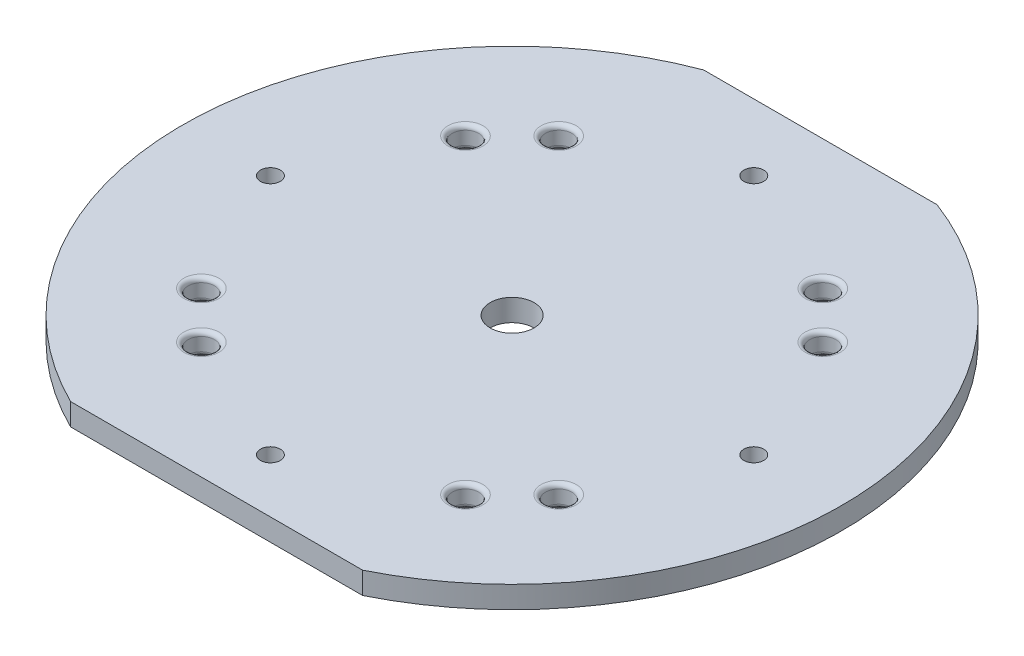
ISO-10303-21;
HEADER;
FILE_DESCRIPTION(('STEP AP214'),'2;1');
FILE_NAME('part.step','',(''),(''),'','','');
FILE_SCHEMA(('AUTOMOTIVE_DESIGN { 1 0 10303 214 1 1 1 1 }'));
ENDSEC;
DATA;
#1=APPLICATION_CONTEXT('core data for automotive mechanical design processes');
#2=APPLICATION_PROTOCOL_DEFINITION('international standard','automotive_design',2000,#1);
#3=PRODUCT_CONTEXT('',#1,'mechanical');
#4=PRODUCT('Part','Part','',(#3));
#5=PRODUCT_RELATED_PRODUCT_CATEGORY('part','',(#4));
#6=PRODUCT_DEFINITION_FORMATION('','',#4);
#7=PRODUCT_DEFINITION_CONTEXT('part definition',#1,'design');
#8=PRODUCT_DEFINITION('design','',#6,#7);
#9=PRODUCT_DEFINITION_SHAPE('','',#8);
#10=(LENGTH_UNIT() NAMED_UNIT(*) SI_UNIT(.MILLI.,.METRE.));
#11=(NAMED_UNIT(*) PLANE_ANGLE_UNIT() SI_UNIT($,.RADIAN.));
#12=(NAMED_UNIT(*) SI_UNIT($,.STERADIAN.) SOLID_ANGLE_UNIT());
#13=UNCERTAINTY_MEASURE_WITH_UNIT(LENGTH_MEASURE(1.E-05),#10,'distance_accuracy_value','');
#14=(GEOMETRIC_REPRESENTATION_CONTEXT(3) GLOBAL_UNCERTAINTY_ASSIGNED_CONTEXT((#13)) GLOBAL_UNIT_ASSIGNED_CONTEXT((#10,
#11,#12)) REPRESENTATION_CONTEXT('',''));
#15=CARTESIAN_POINT('',(0.,0.,0.));
#16=DIRECTION('',(0.,0.,1.));
#17=DIRECTION('',(1.,0.,0.));
#18=AXIS2_PLACEMENT_3D('',#15,#16,#17);
#19=CARTESIAN_POINT('',(0.,0.,0.));
#20=DIRECTION('',(0.,-1.,0.));
#21=DIRECTION('',(0.,0.,-1.));
#22=AXIS2_PLACEMENT_3D('',#19,#20,#21);
#23=CYLINDRICAL_SURFACE('',#22,75.);
#24=DIRECTION('',(0.,-1.,0.));
#25=VECTOR('',#24,1.);
#26=CARTESIAN_POINT('',(26.5518360947035,45.,-70.1427116670007));
#27=LINE('',#26,#25);
#28=CARTESIAN_POINT('',(26.5518360947035,5.,-70.1427116670007));
#29=VERTEX_POINT('',#28);
#30=CARTESIAN_POINT('',(26.5518360947035,0.,-70.1427116670007));
#31=VERTEX_POINT('',#30);
#32=EDGE_CURVE('E70',#29,#31,#27,.T.);
#33=ORIENTED_EDGE('',*,*,#32,.F.);
#34=CARTESIAN_POINT('',(0.,5.,0.));
#35=DIRECTION('',(0.,1.,0.));
#36=DIRECTION('',(0.,0.,1.));
#37=AXIS2_PLACEMENT_3D('',#34,#35,#36);
#38=CIRCLE('',#37,75.);
#39=CARTESIAN_POINT('',(33.2264954516724,5.,67.238381896057));
#40=VERTEX_POINT('',#39);
#41=EDGE_CURVE('E62',#40,#29,#38,.T.);
#42=ORIENTED_EDGE('',*,*,#41,.F.);
#43=DIRECTION('',(0.,-1.,0.));
#44=VECTOR('',#43,1.);
#45=CARTESIAN_POINT('',(33.2264954516723,45.,67.238381896057));
#46=LINE('',#45,#44);
#47=CARTESIAN_POINT('',(33.2264954516723,0.,67.238381896057));
#48=VERTEX_POINT('',#47);
#49=EDGE_CURVE('E84',#40,#48,#46,.T.);
#50=ORIENTED_EDGE('',*,*,#49,.T.);
#51=CARTESIAN_POINT('',(0.,0.,0.));
#52=DIRECTION('',(0.,-1.,0.));
#53=DIRECTION('',(0.,0.,-1.));
#54=AXIS2_PLACEMENT_3D('',#51,#52,#53);
#55=CIRCLE('',#54,75.);
#56=EDGE_CURVE('E87',#31,#48,#55,.T.);
#57=ORIENTED_EDGE('',*,*,#56,.F.);
#58=EDGE_LOOP('',(#33,#42,#50,#57));
#59=FACE_BOUND('',#58,.T.);
#60=ADVANCED_FACE('F47',(#59),#23,.T.);
#61=DIRECTION('',(0.,-1.,0.));
#62=VECTOR('',#61,1.);
#63=CARTESIAN_POINT('',(-33.2264954516723,45.,67.238381896057));
#64=LINE('',#63,#62);
#65=CARTESIAN_POINT('',(-33.2264954516724,5.,67.238381896057));
#66=VERTEX_POINT('',#65);
#67=CARTESIAN_POINT('',(-33.2264954516723,0.,67.238381896057));
#68=VERTEX_POINT('',#67);
#69=EDGE_CURVE('E91',#66,#68,#64,.T.);
#70=ORIENTED_EDGE('',*,*,#69,.F.);
#71=CARTESIAN_POINT('',(-26.5518360947036,5.,-70.1427116670007));
#72=VERTEX_POINT('',#71);
#73=EDGE_CURVE('E401',#72,#66,#38,.T.);
#74=ORIENTED_EDGE('',*,*,#73,.F.);
#75=DIRECTION('',(0.,-1.,0.));
#76=VECTOR('',#75,1.);
#77=CARTESIAN_POINT('',(-26.5518360947035,45.,-70.1427116670007));
#78=LINE('',#77,#76);
#79=CARTESIAN_POINT('',(-26.5518360947035,0.,-70.1427116670007));
#80=VERTEX_POINT('',#79);
#81=EDGE_CURVE('E110',#72,#80,#78,.T.);
#82=ORIENTED_EDGE('',*,*,#81,.T.);
#83=EDGE_CURVE('E105',#68,#80,#55,.T.);
#84=ORIENTED_EDGE('',*,*,#83,.F.);
#85=EDGE_LOOP('',(#70,#74,#82,#84));
#86=FACE_BOUND('',#85,.T.);
#87=ADVANCED_FACE('F219',(#86),#23,.T.);
#88=CARTESIAN_POINT('',(-33.2264954516723,45.,67.238381896057));
#89=DIRECTION('',(0.,0.,1.));
#90=DIRECTION('',(1.,0.,0.));
#91=AXIS2_PLACEMENT_3D('',#88,#89,#90);
#92=PLANE('',#91);
#93=ORIENTED_EDGE('',*,*,#49,.F.);
#94=DIRECTION('',(-1.,0.,0.));
#95=VECTOR('',#94,1.);
#96=CARTESIAN_POINT('',(-33.2264954516723,5.,67.238381896057));
#97=LINE('',#96,#95);
#98=EDGE_CURVE('E405',#40,#66,#97,.T.);
#99=ORIENTED_EDGE('',*,*,#98,.T.);
#100=ORIENTED_EDGE('',*,*,#69,.T.);
#101=DIRECTION('',(-1.,0.,0.));
#102=VECTOR('',#101,1.);
#103=CARTESIAN_POINT('',(-33.2264954516723,0.,67.238381896057));
#104=LINE('',#103,#102);
#105=EDGE_CURVE('E95',#48,#68,#104,.T.);
#106=ORIENTED_EDGE('',*,*,#105,.F.);
#107=EDGE_LOOP('',(#93,#99,#100,#106));
#108=FACE_BOUND('',#107,.T.);
#109=ADVANCED_FACE('F96',(#108),#92,.T.);
#110=CARTESIAN_POINT('',(-26.5518360947035,45.,-70.1427116670007));
#111=DIRECTION('',(0.,0.,-1.));
#112=DIRECTION('',(-1.,0.,0.));
#113=AXIS2_PLACEMENT_3D('',#110,#111,#112);
#114=PLANE('',#113);
#115=ORIENTED_EDGE('',*,*,#81,.F.);
#116=DIRECTION('',(1.,0.,0.));
#117=VECTOR('',#116,1.);
#118=CARTESIAN_POINT('',(-26.5518360947035,5.,-70.1427116670007));
#119=LINE('',#118,#117);
#120=EDGE_CURVE('E402',#72,#29,#119,.T.);
#121=ORIENTED_EDGE('',*,*,#120,.T.);
#122=ORIENTED_EDGE('',*,*,#32,.T.);
#123=DIRECTION('',(1.,0.,0.));
#124=VECTOR('',#123,1.);
#125=CARTESIAN_POINT('',(-26.5518360947035,0.,-70.1427116670007));
#126=LINE('',#125,#124);
#127=EDGE_CURVE('E101',#80,#31,#126,.T.);
#128=ORIENTED_EDGE('',*,*,#127,.F.);
#129=EDGE_LOOP('',(#115,#121,#122,#128));
#130=FACE_BOUND('',#129,.T.);
#131=ADVANCED_FACE('F338',(#130),#114,.T.);
#132=CARTESIAN_POINT('',(5.,0.,0.));
#133=DIRECTION('',(0.,-1.,0.));
#134=DIRECTION('',(0.,0.,-1.));
#135=AXIS2_PLACEMENT_3D('',#132,#133,#134);
#136=PLANE('',#135);
#137=CARTESIAN_POINT('',(40.6586399182265,0.,-30.0520382004282));
#138=DIRECTION('',(0.,-1.,0.));
#139=DIRECTION('',(0.,0.,-1.));
#140=AXIS2_PLACEMENT_3D('',#137,#138,#139);
#141=CIRCLE('',#140,4.);
#142=CARTESIAN_POINT('',(40.6586399182265,0.,-34.0520382004282));
#143=VERTEX_POINT('',#142);
#144=EDGE_CURVE('E142',#143,#143,#141,.F.);
#145=ORIENTED_EDGE('',*,*,#144,.T.);
#146=EDGE_LOOP('',(#145));
#147=FACE_BOUND('',#146,.T.);
#148=CARTESIAN_POINT('',(30.0520382004282,0.,-40.6586399182265));
#149=DIRECTION('',(0.,-1.,0.));
#150=DIRECTION('',(0.,0.,-1.));
#151=AXIS2_PLACEMENT_3D('',#148,#149,#150);
#152=CIRCLE('',#151,4.);
#153=CARTESIAN_POINT('',(30.0520382004282,0.,-44.6586399182265));
#154=VERTEX_POINT('',#153);
#155=EDGE_CURVE('E139',#154,#154,#152,.F.);
#156=ORIENTED_EDGE('',*,*,#155,.T.);
#157=EDGE_LOOP('',(#156));
#158=FACE_BOUND('',#157,.T.);
#159=CARTESIAN_POINT('',(-30.0520382004283,0.,-40.6586399182264));
#160=DIRECTION('',(0.,-1.,0.));
#161=DIRECTION('',(0.,0.,-1.));
#162=AXIS2_PLACEMENT_3D('',#159,#160,#161);
#163=CIRCLE('',#162,4.);
#164=CARTESIAN_POINT('',(-30.0520382004283,0.,-44.6586399182264));
#165=VERTEX_POINT('',#164);
#166=EDGE_CURVE('E136',#165,#165,#163,.F.);
#167=ORIENTED_EDGE('',*,*,#166,.T.);
#168=EDGE_LOOP('',(#167));
#169=FACE_BOUND('',#168,.T.);
#170=CARTESIAN_POINT('',(-40.6586399182265,0.,-30.0520382004282));
#171=DIRECTION('',(0.,-1.,0.));
#172=DIRECTION('',(0.,0.,-1.));
#173=AXIS2_PLACEMENT_3D('',#170,#171,#172);
#174=CIRCLE('',#173,4.);
#175=CARTESIAN_POINT('',(-40.6586399182265,0.,-34.0520382004282));
#176=VERTEX_POINT('',#175);
#177=EDGE_CURVE('E133',#176,#176,#174,.F.);
#178=ORIENTED_EDGE('',*,*,#177,.T.);
#179=EDGE_LOOP('',(#178));
#180=FACE_BOUND('',#179,.T.);
#181=CARTESIAN_POINT('',(-40.6586399182265,0.,30.0520382004283));
#182=DIRECTION('',(0.,-1.,0.));
#183=DIRECTION('',(0.,0.,-1.));
#184=AXIS2_PLACEMENT_3D('',#181,#182,#183);
#185=CIRCLE('',#184,4.);
#186=CARTESIAN_POINT('',(-40.6586399182265,0.,26.0520382004283));
#187=VERTEX_POINT('',#186);
#188=EDGE_CURVE('E130',#187,#187,#185,.F.);
#189=ORIENTED_EDGE('',*,*,#188,.T.);
#190=EDGE_LOOP('',(#189));
#191=FACE_BOUND('',#190,.T.);
#192=CARTESIAN_POINT('',(-30.0520382004283,0.,40.6586399182265));
#193=DIRECTION('',(0.,-1.,0.));
#194=DIRECTION('',(0.,0.,-1.));
#195=AXIS2_PLACEMENT_3D('',#192,#193,#194);
#196=CIRCLE('',#195,4.);
#197=CARTESIAN_POINT('',(-30.0520382004283,0.,36.6586399182265));
#198=VERTEX_POINT('',#197);
#199=EDGE_CURVE('E127',#198,#198,#196,.F.);
#200=ORIENTED_EDGE('',*,*,#199,.T.);
#201=EDGE_LOOP('',(#200));
#202=FACE_BOUND('',#201,.T.);
#203=CARTESIAN_POINT('',(40.6586399182265,0.,30.0520382004283));
#204=DIRECTION('',(0.,-1.,0.));
#205=DIRECTION('',(0.,0.,-1.));
#206=AXIS2_PLACEMENT_3D('',#203,#204,#205);
#207=CIRCLE('',#206,4.);
#208=CARTESIAN_POINT('',(40.6586399182265,0.,26.0520382004283));
#209=VERTEX_POINT('',#208);
#210=EDGE_CURVE('E124',#209,#209,#207,.F.);
#211=ORIENTED_EDGE('',*,*,#210,.T.);
#212=EDGE_LOOP('',(#211));
#213=FACE_BOUND('',#212,.T.);
#214=CARTESIAN_POINT('',(30.0520382004283,0.,40.6586399182265));
#215=DIRECTION('',(0.,-1.,0.));
#216=DIRECTION('',(0.,0.,-1.));
#217=AXIS2_PLACEMENT_3D('',#214,#215,#216);
#218=CIRCLE('',#217,4.);
#219=CARTESIAN_POINT('',(30.0520382004283,0.,36.6586399182265));
#220=VERTEX_POINT('',#219);
#221=EDGE_CURVE('E121',#220,#220,#218,.F.);
#222=ORIENTED_EDGE('',*,*,#221,.T.);
#223=EDGE_LOOP('',(#222));
#224=FACE_BOUND('',#223,.T.);
#225=CARTESIAN_POINT('',(-55.,0.,0.));
#226=DIRECTION('',(0.,-1.,0.));
#227=DIRECTION('',(0.,0.,-1.));
#228=AXIS2_PLACEMENT_3D('',#225,#226,#227);
#229=CIRCLE('',#228,2.25);
#230=CARTESIAN_POINT('',(-55.,0.,-2.25));
#231=VERTEX_POINT('',#230);
#232=EDGE_CURVE('E407',#231,#231,#229,.T.);
#233=ORIENTED_EDGE('',*,*,#232,.F.);
#234=EDGE_LOOP('',(#233));
#235=FACE_BOUND('',#234,.T.);
#236=CARTESIAN_POINT('',(55.,0.,0.));
#237=DIRECTION('',(0.,-1.,0.));
#238=DIRECTION('',(0.,0.,-1.));
#239=AXIS2_PLACEMENT_3D('',#236,#237,#238);
#240=CIRCLE('',#239,2.25);
#241=CARTESIAN_POINT('',(55.,0.,-2.25));
#242=VERTEX_POINT('',#241);
#243=EDGE_CURVE('E415',#242,#242,#240,.T.);
#244=ORIENTED_EDGE('',*,*,#243,.F.);
#245=EDGE_LOOP('',(#244));
#246=FACE_BOUND('',#245,.T.);
#247=CARTESIAN_POINT('',(0.,0.,-55.));
#248=DIRECTION('',(0.,-1.,0.));
#249=DIRECTION('',(0.,0.,-1.));
#250=AXIS2_PLACEMENT_3D('',#247,#248,#249);
#251=CIRCLE('',#250,2.25);
#252=CARTESIAN_POINT('',(0.,0.,-57.25));
#253=VERTEX_POINT('',#252);
#254=EDGE_CURVE('E387',#253,#253,#251,.T.);
#255=ORIENTED_EDGE('',*,*,#254,.F.);
#256=EDGE_LOOP('',(#255));
#257=FACE_BOUND('',#256,.T.);
#258=CARTESIAN_POINT('',(0.,0.,55.));
#259=DIRECTION('',(0.,-1.,0.));
#260=DIRECTION('',(0.,0.,-1.));
#261=AXIS2_PLACEMENT_3D('',#258,#259,#260);
#262=CIRCLE('',#261,2.25);
#263=CARTESIAN_POINT('',(0.,0.,52.75));
#264=VERTEX_POINT('',#263);
#265=EDGE_CURVE('E92',#264,#264,#262,.T.);
#266=ORIENTED_EDGE('',*,*,#265,.F.);
#267=EDGE_LOOP('',(#266));
#268=FACE_BOUND('',#267,.T.);
#269=CARTESIAN_POINT('',(0.,0.,0.));
#270=DIRECTION('',(0.,-1.,0.));
#271=DIRECTION('',(0.,0.,-1.));
#272=AXIS2_PLACEMENT_3D('',#269,#270,#271);
#273=CIRCLE('',#272,5.);
#274=CARTESIAN_POINT('',(0.,0.,-5.));
#275=VERTEX_POINT('',#274);
#276=EDGE_CURVE('E104',#275,#275,#273,.T.);
#277=ORIENTED_EDGE('',*,*,#276,.F.);
#278=EDGE_LOOP('',(#277));
#279=FACE_BOUND('',#278,.T.);
#280=ORIENTED_EDGE('',*,*,#83,.T.);
#281=ORIENTED_EDGE('',*,*,#127,.T.);
#282=ORIENTED_EDGE('',*,*,#56,.T.);
#283=ORIENTED_EDGE('',*,*,#105,.T.);
#284=EDGE_LOOP('',(#280,#281,#282,#283));
#285=FACE_BOUND('',#284,.T.);
#286=ADVANCED_FACE('F103',(#147,#158,#169,#180,#191,#202,#213,#224,#235,#246,#257,#268,#279,
#285),#136,.T.);
#287=CARTESIAN_POINT('',(73.,5.,0.));
#288=DIRECTION('',(0.,1.,0.));
#289=DIRECTION('',(0.,0.,1.));
#290=AXIS2_PLACEMENT_3D('',#287,#288,#289);
#291=PLANE('',#290);
#292=CARTESIAN_POINT('',(40.6586399182265,5.,-30.0520382004282));
#293=DIRECTION('',(0.,1.,0.));
#294=DIRECTION('',(0.,0.,1.));
#295=AXIS2_PLACEMENT_3D('',#292,#293,#294);
#296=CIRCLE('',#295,4.);
#297=CARTESIAN_POINT('',(40.6586399182265,5.,-26.0520382004282));
#298=VERTEX_POINT('',#297);
#299=EDGE_CURVE('E166',#298,#298,#296,.F.);
#300=ORIENTED_EDGE('',*,*,#299,.T.);
#301=EDGE_LOOP('',(#300));
#302=FACE_BOUND('',#301,.T.);
#303=CARTESIAN_POINT('',(30.0520382004282,5.,-40.6586399182265));
#304=DIRECTION('',(0.,1.,0.));
#305=DIRECTION('',(0.,0.,1.));
#306=AXIS2_PLACEMENT_3D('',#303,#304,#305);
#307=CIRCLE('',#306,4.);
#308=CARTESIAN_POINT('',(30.0520382004282,5.,-36.6586399182265));
#309=VERTEX_POINT('',#308);
#310=EDGE_CURVE('E163',#309,#309,#307,.F.);
#311=ORIENTED_EDGE('',*,*,#310,.T.);
#312=EDGE_LOOP('',(#311));
#313=FACE_BOUND('',#312,.T.);
#314=CARTESIAN_POINT('',(-30.0520382004283,5.,-40.6586399182264));
#315=DIRECTION('',(0.,1.,0.));
#316=DIRECTION('',(0.,0.,1.));
#317=AXIS2_PLACEMENT_3D('',#314,#315,#316);
#318=CIRCLE('',#317,4.);
#319=CARTESIAN_POINT('',(-30.0520382004283,5.,-36.6586399182265));
#320=VERTEX_POINT('',#319);
#321=EDGE_CURVE('E160',#320,#320,#318,.F.);
#322=ORIENTED_EDGE('',*,*,#321,.T.);
#323=EDGE_LOOP('',(#322));
#324=FACE_BOUND('',#323,.T.);
#325=CARTESIAN_POINT('',(-40.6586399182265,5.,-30.0520382004282));
#326=DIRECTION('',(0.,1.,0.));
#327=DIRECTION('',(0.,0.,1.));
#328=AXIS2_PLACEMENT_3D('',#325,#326,#327);
#329=CIRCLE('',#328,4.);
#330=CARTESIAN_POINT('',(-40.6586399182265,5.,-26.0520382004282));
#331=VERTEX_POINT('',#330);
#332=EDGE_CURVE('E157',#331,#331,#329,.F.);
#333=ORIENTED_EDGE('',*,*,#332,.T.);
#334=EDGE_LOOP('',(#333));
#335=FACE_BOUND('',#334,.T.);
#336=CARTESIAN_POINT('',(-40.6586399182265,5.,30.0520382004283));
#337=DIRECTION('',(0.,1.,0.));
#338=DIRECTION('',(0.,0.,1.));
#339=AXIS2_PLACEMENT_3D('',#336,#337,#338);
#340=CIRCLE('',#339,4.);
#341=CARTESIAN_POINT('',(-40.6586399182265,5.,34.0520382004283));
#342=VERTEX_POINT('',#341);
#343=EDGE_CURVE('E154',#342,#342,#340,.F.);
#344=ORIENTED_EDGE('',*,*,#343,.T.);
#345=EDGE_LOOP('',(#344));
#346=FACE_BOUND('',#345,.T.);
#347=CARTESIAN_POINT('',(-30.0520382004283,5.,40.6586399182265));
#348=DIRECTION('',(0.,1.,0.));
#349=DIRECTION('',(0.,0.,1.));
#350=AXIS2_PLACEMENT_3D('',#347,#348,#349);
#351=CIRCLE('',#350,4.);
#352=CARTESIAN_POINT('',(-30.0520382004283,5.,44.6586399182265));
#353=VERTEX_POINT('',#352);
#354=EDGE_CURVE('E151',#353,#353,#351,.F.);
#355=ORIENTED_EDGE('',*,*,#354,.T.);
#356=EDGE_LOOP('',(#355));
#357=FACE_BOUND('',#356,.T.);
#358=CARTESIAN_POINT('',(40.6586399182265,5.,30.0520382004283));
#359=DIRECTION('',(0.,1.,0.));
#360=DIRECTION('',(0.,0.,1.));
#361=AXIS2_PLACEMENT_3D('',#358,#359,#360);
#362=CIRCLE('',#361,4.);
#363=CARTESIAN_POINT('',(40.6586399182265,5.,34.0520382004283));
#364=VERTEX_POINT('',#363);
#365=EDGE_CURVE('E148',#364,#364,#362,.F.);
#366=ORIENTED_EDGE('',*,*,#365,.T.);
#367=EDGE_LOOP('',(#366));
#368=FACE_BOUND('',#367,.T.);
#369=CARTESIAN_POINT('',(30.0520382004283,5.,40.6586399182265));
#370=DIRECTION('',(0.,1.,0.));
#371=DIRECTION('',(0.,0.,1.));
#372=AXIS2_PLACEMENT_3D('',#369,#370,#371);
#373=CIRCLE('',#372,4.);
#374=CARTESIAN_POINT('',(30.0520382004283,5.,44.6586399182265));
#375=VERTEX_POINT('',#374);
#376=EDGE_CURVE('E145',#375,#375,#373,.F.);
#377=ORIENTED_EDGE('',*,*,#376,.T.);
#378=EDGE_LOOP('',(#377));
#379=FACE_BOUND('',#378,.T.);
#380=CARTESIAN_POINT('',(-55.,5.,0.));
#381=DIRECTION('',(0.,1.,0.));
#382=DIRECTION('',(0.,0.,1.));
#383=AXIS2_PLACEMENT_3D('',#380,#381,#382);
#384=CIRCLE('',#383,2.25);
#385=CARTESIAN_POINT('',(-55.,5.,2.25));
#386=VERTEX_POINT('',#385);
#387=EDGE_CURVE('E375',#386,#386,#384,.T.);
#388=ORIENTED_EDGE('',*,*,#387,.F.);
#389=EDGE_LOOP('',(#388));
#390=FACE_BOUND('',#389,.T.);
#391=CARTESIAN_POINT('',(55.,5.,0.));
#392=DIRECTION('',(0.,1.,0.));
#393=DIRECTION('',(0.,0.,1.));
#394=AXIS2_PLACEMENT_3D('',#391,#392,#393);
#395=CIRCLE('',#394,2.25);
#396=CARTESIAN_POINT('',(55.,5.,2.25));
#397=VERTEX_POINT('',#396);
#398=EDGE_CURVE('E379',#397,#397,#395,.T.);
#399=ORIENTED_EDGE('',*,*,#398,.F.);
#400=EDGE_LOOP('',(#399));
#401=FACE_BOUND('',#400,.T.);
#402=CARTESIAN_POINT('',(0.,5.,-55.));
#403=DIRECTION('',(0.,1.,0.));
#404=DIRECTION('',(0.,0.,1.));
#405=AXIS2_PLACEMENT_3D('',#402,#403,#404);
#406=CIRCLE('',#405,2.25);
#407=CARTESIAN_POINT('',(0.,5.,-52.75));
#408=VERTEX_POINT('',#407);
#409=EDGE_CURVE('E383',#408,#408,#406,.T.);
#410=ORIENTED_EDGE('',*,*,#409,.F.);
#411=EDGE_LOOP('',(#410));
#412=FACE_BOUND('',#411,.T.);
#413=CARTESIAN_POINT('',(0.,5.,55.));
#414=DIRECTION('',(0.,1.,0.));
#415=DIRECTION('',(0.,0.,1.));
#416=AXIS2_PLACEMENT_3D('',#413,#414,#415);
#417=CIRCLE('',#416,2.25);
#418=CARTESIAN_POINT('',(0.,5.,57.25));
#419=VERTEX_POINT('',#418);
#420=EDGE_CURVE('E386',#419,#419,#417,.T.);
#421=ORIENTED_EDGE('',*,*,#420,.F.);
#422=EDGE_LOOP('',(#421));
#423=FACE_BOUND('',#422,.T.);
#424=CARTESIAN_POINT('',(0.,4.99999999999999,0.));
#425=DIRECTION('',(0.,-1.,0.));
#426=DIRECTION('',(0.,0.,-1.));
#427=AXIS2_PLACEMENT_3D('',#424,#425,#426);
#428=CIRCLE('',#427,5.);
#429=CARTESIAN_POINT('',(0.,4.99999999999999,-5.));
#430=VERTEX_POINT('',#429);
#431=EDGE_CURVE('E108',#430,#430,#428,.T.);
#432=ORIENTED_EDGE('',*,*,#431,.T.);
#433=EDGE_LOOP('',(#432));
#434=FACE_BOUND('',#433,.T.);
#435=ORIENTED_EDGE('',*,*,#41,.T.);
#436=ORIENTED_EDGE('',*,*,#120,.F.);
#437=ORIENTED_EDGE('',*,*,#73,.T.);
#438=ORIENTED_EDGE('',*,*,#98,.F.);
#439=EDGE_LOOP('',(#435,#436,#437,#438));
#440=FACE_BOUND('',#439,.T.);
#441=ADVANCED_FACE('F227',(#302,#313,#324,#335,#346,#357,#368,#379,#390,#401,#412,#423,#434,
#440),#291,.T.);
#442=CARTESIAN_POINT('',(0.,0.,0.));
#443=DIRECTION('',(0.,-1.,0.));
#444=DIRECTION('',(0.,0.,-1.));
#445=AXIS2_PLACEMENT_3D('',#442,#443,#444);
#446=CYLINDRICAL_SURFACE('',#445,5.);
#447=ORIENTED_EDGE('',*,*,#276,.T.);
#448=EDGE_LOOP('',(#447));
#449=FACE_BOUND('',#448,.T.);
#450=ORIENTED_EDGE('',*,*,#431,.F.);
#451=EDGE_LOOP('',(#450));
#452=FACE_BOUND('',#451,.T.);
#453=ADVANCED_FACE('F336',(#449,#452),#446,.F.);
#454=CARTESIAN_POINT('',(0.,5.,55.));
#455=DIRECTION('',(0.,1.,0.));
#456=DIRECTION('',(0.,0.,1.));
#457=AXIS2_PLACEMENT_3D('',#454,#455,#456);
#458=CYLINDRICAL_SURFACE('',#457,2.25);
#459=ORIENTED_EDGE('',*,*,#420,.T.);
#460=EDGE_LOOP('',(#459));
#461=FACE_BOUND('',#460,.T.);
#462=ORIENTED_EDGE('',*,*,#265,.T.);
#463=EDGE_LOOP('',(#462));
#464=FACE_BOUND('',#463,.T.);
#465=ADVANCED_FACE('F332',(#461,#464),#458,.F.);
#466=CARTESIAN_POINT('',(0.,5.,-55.));
#467=DIRECTION('',(0.,1.,0.));
#468=DIRECTION('',(0.,0.,1.));
#469=AXIS2_PLACEMENT_3D('',#466,#467,#468);
#470=CYLINDRICAL_SURFACE('',#469,2.25);
#471=ORIENTED_EDGE('',*,*,#409,.T.);
#472=EDGE_LOOP('',(#471));
#473=FACE_BOUND('',#472,.T.);
#474=ORIENTED_EDGE('',*,*,#254,.T.);
#475=EDGE_LOOP('',(#474));
#476=FACE_BOUND('',#475,.T.);
#477=ADVANCED_FACE('F328',(#473,#476),#470,.F.);
#478=CARTESIAN_POINT('',(55.,5.,0.));
#479=DIRECTION('',(0.,1.,0.));
#480=DIRECTION('',(0.,0.,1.));
#481=AXIS2_PLACEMENT_3D('',#478,#479,#480);
#482=CYLINDRICAL_SURFACE('',#481,2.25);
#483=ORIENTED_EDGE('',*,*,#398,.T.);
#484=EDGE_LOOP('',(#483));
#485=FACE_BOUND('',#484,.T.);
#486=ORIENTED_EDGE('',*,*,#243,.T.);
#487=EDGE_LOOP('',(#486));
#488=FACE_BOUND('',#487,.T.);
#489=ADVANCED_FACE('F324',(#485,#488),#482,.F.);
#490=CARTESIAN_POINT('',(-55.,5.,0.));
#491=DIRECTION('',(0.,1.,0.));
#492=DIRECTION('',(0.,0.,1.));
#493=AXIS2_PLACEMENT_3D('',#490,#491,#492);
#494=CYLINDRICAL_SURFACE('',#493,2.25);
#495=ORIENTED_EDGE('',*,*,#387,.T.);
#496=EDGE_LOOP('',(#495));
#497=FACE_BOUND('',#496,.T.);
#498=ORIENTED_EDGE('',*,*,#232,.T.);
#499=EDGE_LOOP('',(#498));
#500=FACE_BOUND('',#499,.T.);
#501=ADVANCED_FACE('F320',(#497,#500),#494,.F.);
#502=CARTESIAN_POINT('',(-30.0520382004283,5.,-40.6586399182264));
#503=DIRECTION('',(0.,1.,0.));
#504=DIRECTION('',(0.,0.,1.));
#505=AXIS2_PLACEMENT_3D('',#502,#503,#504);
#506=CYLINDRICAL_SURFACE('',#505,3.);
#507=CARTESIAN_POINT('',(-30.0520382004283,1.,-40.6586399182264));
#508=DIRECTION('',(0.,-1.,0.));
#509=DIRECTION('',(0.,0.,-1.));
#510=AXIS2_PLACEMENT_3D('',#507,#508,#509);
#511=CIRCLE('',#510,3.);
#512=CARTESIAN_POINT('',(-30.0520382004283,1.,-43.6586399182265));
#513=VERTEX_POINT('',#512);
#514=EDGE_CURVE('E178',#513,#513,#511,.T.);
#515=ORIENTED_EDGE('',*,*,#514,.T.);
#516=EDGE_LOOP('',(#515));
#517=FACE_BOUND('',#516,.T.);
#518=CARTESIAN_POINT('',(-30.0520382004283,4.,-40.6586399182264));
#519=DIRECTION('',(0.,1.,0.));
#520=DIRECTION('',(0.,0.,1.));
#521=AXIS2_PLACEMENT_3D('',#518,#519,#520);
#522=CIRCLE('',#521,3.);
#523=CARTESIAN_POINT('',(-30.0520382004283,4.,-37.6586399182264));
#524=VERTEX_POINT('',#523);
#525=EDGE_CURVE('E175',#524,#524,#522,.T.);
#526=ORIENTED_EDGE('',*,*,#525,.T.);
#527=EDGE_LOOP('',(#526));
#528=FACE_BOUND('',#527,.T.);
#529=ADVANCED_FACE('F316',(#517,#528),#506,.F.);
#530=CARTESIAN_POINT('',(-40.6586399182265,5.,-30.0520382004282));
#531=DIRECTION('',(0.,1.,0.));
#532=DIRECTION('',(0.,0.,1.));
#533=AXIS2_PLACEMENT_3D('',#530,#531,#532);
#534=CYLINDRICAL_SURFACE('',#533,3.);
#535=CARTESIAN_POINT('',(-40.6586399182265,1.,-30.0520382004282));
#536=DIRECTION('',(0.,-1.,0.));
#537=DIRECTION('',(0.,0.,-1.));
#538=AXIS2_PLACEMENT_3D('',#535,#536,#537);
#539=CIRCLE('',#538,3.);
#540=CARTESIAN_POINT('',(-40.6586399182265,1.,-33.0520382004282));
#541=VERTEX_POINT('',#540);
#542=EDGE_CURVE('E184',#541,#541,#539,.T.);
#543=ORIENTED_EDGE('',*,*,#542,.T.);
#544=EDGE_LOOP('',(#543));
#545=FACE_BOUND('',#544,.T.);
#546=CARTESIAN_POINT('',(-40.6586399182265,4.,-30.0520382004282));
#547=DIRECTION('',(0.,1.,0.));
#548=DIRECTION('',(0.,0.,1.));
#549=AXIS2_PLACEMENT_3D('',#546,#547,#548);
#550=CIRCLE('',#549,3.);
#551=CARTESIAN_POINT('',(-40.6586399182265,4.,-27.0520382004282));
#552=VERTEX_POINT('',#551);
#553=EDGE_CURVE('E181',#552,#552,#550,.T.);
#554=ORIENTED_EDGE('',*,*,#553,.T.);
#555=EDGE_LOOP('',(#554));
#556=FACE_BOUND('',#555,.T.);
#557=ADVANCED_FACE('F312',(#545,#556),#534,.F.);
#558=CARTESIAN_POINT('',(-40.6586399182265,5.,30.0520382004283));
#559=DIRECTION('',(0.,1.,0.));
#560=DIRECTION('',(0.,0.,1.));
#561=AXIS2_PLACEMENT_3D('',#558,#559,#560);
#562=CYLINDRICAL_SURFACE('',#561,3.);
#563=CARTESIAN_POINT('',(-40.6586399182265,1.,30.0520382004283));
#564=DIRECTION('',(0.,-1.,0.));
#565=DIRECTION('',(0.,0.,-1.));
#566=AXIS2_PLACEMENT_3D('',#563,#564,#565);
#567=CIRCLE('',#566,3.);
#568=CARTESIAN_POINT('',(-40.6586399182265,1.,27.0520382004283));
#569=VERTEX_POINT('',#568);
#570=EDGE_CURVE('E190',#569,#569,#567,.T.);
#571=ORIENTED_EDGE('',*,*,#570,.T.);
#572=EDGE_LOOP('',(#571));
#573=FACE_BOUND('',#572,.T.);
#574=CARTESIAN_POINT('',(-40.6586399182265,4.,30.0520382004283));
#575=DIRECTION('',(0.,1.,0.));
#576=DIRECTION('',(0.,0.,1.));
#577=AXIS2_PLACEMENT_3D('',#574,#575,#576);
#578=CIRCLE('',#577,3.);
#579=CARTESIAN_POINT('',(-40.6586399182265,4.,33.0520382004283));
#580=VERTEX_POINT('',#579);
#581=EDGE_CURVE('E187',#580,#580,#578,.T.);
#582=ORIENTED_EDGE('',*,*,#581,.T.);
#583=EDGE_LOOP('',(#582));
#584=FACE_BOUND('',#583,.T.);
#585=ADVANCED_FACE('F308',(#573,#584),#562,.F.);
#586=CARTESIAN_POINT('',(-30.0520382004283,5.,40.6586399182265));
#587=DIRECTION('',(0.,1.,0.));
#588=DIRECTION('',(0.,0.,1.));
#589=AXIS2_PLACEMENT_3D('',#586,#587,#588);
#590=CYLINDRICAL_SURFACE('',#589,3.);
#591=CARTESIAN_POINT('',(-30.0520382004283,1.,40.6586399182265));
#592=DIRECTION('',(0.,-1.,0.));
#593=DIRECTION('',(0.,0.,-1.));
#594=AXIS2_PLACEMENT_3D('',#591,#592,#593);
#595=CIRCLE('',#594,3.);
#596=CARTESIAN_POINT('',(-30.0520382004283,1.,37.6586399182265));
#597=VERTEX_POINT('',#596);
#598=EDGE_CURVE('E196',#597,#597,#595,.T.);
#599=ORIENTED_EDGE('',*,*,#598,.T.);
#600=EDGE_LOOP('',(#599));
#601=FACE_BOUND('',#600,.T.);
#602=CARTESIAN_POINT('',(-30.0520382004283,4.,40.6586399182265));
#603=DIRECTION('',(0.,1.,0.));
#604=DIRECTION('',(0.,0.,1.));
#605=AXIS2_PLACEMENT_3D('',#602,#603,#604);
#606=CIRCLE('',#605,3.);
#607=CARTESIAN_POINT('',(-30.0520382004283,4.,43.6586399182265));
#608=VERTEX_POINT('',#607);
#609=EDGE_CURVE('E193',#608,#608,#606,.T.);
#610=ORIENTED_EDGE('',*,*,#609,.T.);
#611=EDGE_LOOP('',(#610));
#612=FACE_BOUND('',#611,.T.);
#613=ADVANCED_FACE('F301',(#601,#612),#590,.F.);
#614=CARTESIAN_POINT('',(30.0520382004283,5.,40.6586399182265));
#615=DIRECTION('',(0.,1.,0.));
#616=DIRECTION('',(0.,0.,1.));
#617=AXIS2_PLACEMENT_3D('',#614,#615,#616);
#618=CYLINDRICAL_SURFACE('',#617,3.);
#619=CARTESIAN_POINT('',(30.0520382004283,1.,40.6586399182265));
#620=DIRECTION('',(0.,-1.,0.));
#621=DIRECTION('',(0.,0.,-1.));
#622=AXIS2_PLACEMENT_3D('',#619,#620,#621);
#623=CIRCLE('',#622,3.);
#624=CARTESIAN_POINT('',(30.0520382004283,1.,37.6586399182265));
#625=VERTEX_POINT('',#624);
#626=EDGE_CURVE('E11',#625,#625,#623,.T.);
#627=ORIENTED_EDGE('',*,*,#626,.T.);
#628=EDGE_LOOP('',(#627));
#629=FACE_BOUND('',#628,.T.);
#630=CARTESIAN_POINT('',(30.0520382004283,4.,40.6586399182265));
#631=DIRECTION('',(0.,1.,0.));
#632=DIRECTION('',(0.,0.,1.));
#633=AXIS2_PLACEMENT_3D('',#630,#631,#632);
#634=CIRCLE('',#633,3.);
#635=CARTESIAN_POINT('',(30.0520382004283,4.,43.6586399182265));
#636=VERTEX_POINT('',#635);
#637=EDGE_CURVE('E55',#636,#636,#634,.T.);
#638=ORIENTED_EDGE('',*,*,#637,.T.);
#639=EDGE_LOOP('',(#638));
#640=FACE_BOUND('',#639,.T.);
#641=ADVANCED_FACE('F207',(#629,#640),#618,.F.);
#642=CARTESIAN_POINT('',(40.6586399182265,5.,30.0520382004283));
#643=DIRECTION('',(0.,1.,0.));
#644=DIRECTION('',(0.,0.,1.));
#645=AXIS2_PLACEMENT_3D('',#642,#643,#644);
#646=CYLINDRICAL_SURFACE('',#645,3.);
#647=CARTESIAN_POINT('',(40.6586399182265,1.,30.0520382004283));
#648=DIRECTION('',(0.,-1.,0.));
#649=DIRECTION('',(0.,0.,-1.));
#650=AXIS2_PLACEMENT_3D('',#647,#648,#649);
#651=CIRCLE('',#650,3.);
#652=CARTESIAN_POINT('',(40.6586399182265,1.,27.0520382004283));
#653=VERTEX_POINT('',#652);
#654=EDGE_CURVE('E202',#653,#653,#651,.T.);
#655=ORIENTED_EDGE('',*,*,#654,.T.);
#656=EDGE_LOOP('',(#655));
#657=FACE_BOUND('',#656,.T.);
#658=CARTESIAN_POINT('',(40.6586399182265,4.,30.0520382004283));
#659=DIRECTION('',(0.,1.,0.));
#660=DIRECTION('',(0.,0.,1.));
#661=AXIS2_PLACEMENT_3D('',#658,#659,#660);
#662=CIRCLE('',#661,3.);
#663=CARTESIAN_POINT('',(40.6586399182265,4.,33.0520382004283));
#664=VERTEX_POINT('',#663);
#665=EDGE_CURVE('E199',#664,#664,#662,.T.);
#666=ORIENTED_EDGE('',*,*,#665,.T.);
#667=EDGE_LOOP('',(#666));
#668=FACE_BOUND('',#667,.T.);
#669=ADVANCED_FACE('F290',(#657,#668),#646,.F.);
#670=CARTESIAN_POINT('',(40.6586399182265,5.,-30.0520382004282));
#671=DIRECTION('',(0.,1.,0.));
#672=DIRECTION('',(0.,0.,1.));
#673=AXIS2_PLACEMENT_3D('',#670,#671,#672);
#674=CYLINDRICAL_SURFACE('',#673,3.);
#675=CARTESIAN_POINT('',(40.6586399182265,1.,-30.0520382004282));
#676=DIRECTION('',(0.,-1.,0.));
#677=DIRECTION('',(0.,0.,-1.));
#678=AXIS2_PLACEMENT_3D('',#675,#676,#677);
#679=CIRCLE('',#678,3.);
#680=CARTESIAN_POINT('',(40.6586399182265,1.,-33.0520382004282));
#681=VERTEX_POINT('',#680);
#682=EDGE_CURVE('E118',#681,#681,#679,.T.);
#683=ORIENTED_EDGE('',*,*,#682,.T.);
#684=EDGE_LOOP('',(#683));
#685=FACE_BOUND('',#684,.T.);
#686=CARTESIAN_POINT('',(40.6586399182265,4.,-30.0520382004282));
#687=DIRECTION('',(0.,1.,0.));
#688=DIRECTION('',(0.,0.,1.));
#689=AXIS2_PLACEMENT_3D('',#686,#687,#688);
#690=CIRCLE('',#689,3.);
#691=CARTESIAN_POINT('',(40.6586399182265,4.,-27.0520382004282));
#692=VERTEX_POINT('',#691);
#693=EDGE_CURVE('E115',#692,#692,#690,.T.);
#694=ORIENTED_EDGE('',*,*,#693,.T.);
#695=EDGE_LOOP('',(#694));
#696=FACE_BOUND('',#695,.T.);
#697=ADVANCED_FACE('F292',(#685,#696),#674,.F.);
#698=CARTESIAN_POINT('',(30.0520382004282,5.,-40.6586399182265));
#699=DIRECTION('',(0.,1.,0.));
#700=DIRECTION('',(0.,0.,1.));
#701=AXIS2_PLACEMENT_3D('',#698,#699,#700);
#702=CYLINDRICAL_SURFACE('',#701,3.);
#703=CARTESIAN_POINT('',(30.0520382004282,1.,-40.6586399182265));
#704=DIRECTION('',(0.,-1.,0.));
#705=DIRECTION('',(0.,0.,-1.));
#706=AXIS2_PLACEMENT_3D('',#703,#704,#705);
#707=CIRCLE('',#706,3.);
#708=CARTESIAN_POINT('',(30.0520382004282,1.,-43.6586399182265));
#709=VERTEX_POINT('',#708);
#710=EDGE_CURVE('E172',#709,#709,#707,.T.);
#711=ORIENTED_EDGE('',*,*,#710,.T.);
#712=EDGE_LOOP('',(#711));
#713=FACE_BOUND('',#712,.T.);
#714=CARTESIAN_POINT('',(30.0520382004282,4.,-40.6586399182265));
#715=DIRECTION('',(0.,1.,0.));
#716=DIRECTION('',(0.,0.,1.));
#717=AXIS2_PLACEMENT_3D('',#714,#715,#716);
#718=CIRCLE('',#717,3.);
#719=CARTESIAN_POINT('',(30.0520382004282,4.,-37.6586399182265));
#720=VERTEX_POINT('',#719);
#721=EDGE_CURVE('E169',#720,#720,#718,.T.);
#722=ORIENTED_EDGE('',*,*,#721,.T.);
#723=EDGE_LOOP('',(#722));
#724=FACE_BOUND('',#723,.T.);
#725=ADVANCED_FACE('F233',(#713,#724),#702,.F.);
#726=CARTESIAN_POINT('',(40.6586399182265,1.,-30.0520382004282));
#727=DIRECTION('',(0.,-1.,0.));
#728=DIRECTION('',(0.,0.,-1.));
#729=AXIS2_PLACEMENT_3D('',#726,#727,#728);
#730=TOROIDAL_SURFACE('',#729,4.,1.);
#731=ORIENTED_EDGE('',*,*,#144,.F.);
#732=EDGE_LOOP('',(#731));
#733=FACE_BOUND('',#732,.T.);
#734=ORIENTED_EDGE('',*,*,#682,.F.);
#735=EDGE_LOOP('',(#734));
#736=FACE_BOUND('',#735,.T.);
#737=ADVANCED_FACE('F229',(#733,#736),#730,.T.);
#738=CARTESIAN_POINT('',(40.6586399182265,4.,-30.0520382004282));
#739=DIRECTION('',(0.,1.,0.));
#740=DIRECTION('',(0.,0.,1.));
#741=AXIS2_PLACEMENT_3D('',#738,#739,#740);
#742=TOROIDAL_SURFACE('',#741,4.,1.);
#743=ORIENTED_EDGE('',*,*,#299,.F.);
#744=EDGE_LOOP('',(#743));
#745=FACE_BOUND('',#744,.T.);
#746=ORIENTED_EDGE('',*,*,#693,.F.);
#747=EDGE_LOOP('',(#746));
#748=FACE_BOUND('',#747,.T.);
#749=ADVANCED_FACE('F232',(#745,#748),#742,.T.);
#750=CARTESIAN_POINT('',(30.0520382004282,1.,-40.6586399182265));
#751=DIRECTION('',(0.,-1.,0.));
#752=DIRECTION('',(0.,0.,-1.));
#753=AXIS2_PLACEMENT_3D('',#750,#751,#752);
#754=TOROIDAL_SURFACE('',#753,4.,1.);
#755=ORIENTED_EDGE('',*,*,#155,.F.);
#756=EDGE_LOOP('',(#755));
#757=FACE_BOUND('',#756,.T.);
#758=ORIENTED_EDGE('',*,*,#710,.F.);
#759=EDGE_LOOP('',(#758));
#760=FACE_BOUND('',#759,.T.);
#761=ADVANCED_FACE('F237',(#757,#760),#754,.T.);
#762=CARTESIAN_POINT('',(30.0520382004282,4.,-40.6586399182265));
#763=DIRECTION('',(0.,1.,0.));
#764=DIRECTION('',(0.,0.,1.));
#765=AXIS2_PLACEMENT_3D('',#762,#763,#764);
#766=TOROIDAL_SURFACE('',#765,4.,1.);
#767=ORIENTED_EDGE('',*,*,#310,.F.);
#768=EDGE_LOOP('',(#767));
#769=FACE_BOUND('',#768,.T.);
#770=ORIENTED_EDGE('',*,*,#721,.F.);
#771=EDGE_LOOP('',(#770));
#772=FACE_BOUND('',#771,.T.);
#773=ADVANCED_FACE('F241',(#769,#772),#766,.T.);
#774=CARTESIAN_POINT('',(-30.0520382004283,1.,-40.6586399182264));
#775=DIRECTION('',(0.,-1.,0.));
#776=DIRECTION('',(0.,0.,-1.));
#777=AXIS2_PLACEMENT_3D('',#774,#775,#776);
#778=TOROIDAL_SURFACE('',#777,4.,1.);
#779=ORIENTED_EDGE('',*,*,#166,.F.);
#780=EDGE_LOOP('',(#779));
#781=FACE_BOUND('',#780,.T.);
#782=ORIENTED_EDGE('',*,*,#514,.F.);
#783=EDGE_LOOP('',(#782));
#784=FACE_BOUND('',#783,.T.);
#785=ADVANCED_FACE('F245',(#781,#784),#778,.T.);
#786=CARTESIAN_POINT('',(-30.0520382004283,4.,-40.6586399182264));
#787=DIRECTION('',(0.,1.,0.));
#788=DIRECTION('',(0.,0.,1.));
#789=AXIS2_PLACEMENT_3D('',#786,#787,#788);
#790=TOROIDAL_SURFACE('',#789,4.,1.);
#791=ORIENTED_EDGE('',*,*,#321,.F.);
#792=EDGE_LOOP('',(#791));
#793=FACE_BOUND('',#792,.T.);
#794=ORIENTED_EDGE('',*,*,#525,.F.);
#795=EDGE_LOOP('',(#794));
#796=FACE_BOUND('',#795,.T.);
#797=ADVANCED_FACE('F249',(#793,#796),#790,.T.);
#798=CARTESIAN_POINT('',(-40.6586399182265,1.,-30.0520382004282));
#799=DIRECTION('',(0.,-1.,0.));
#800=DIRECTION('',(0.,0.,-1.));
#801=AXIS2_PLACEMENT_3D('',#798,#799,#800);
#802=TOROIDAL_SURFACE('',#801,4.,1.);
#803=ORIENTED_EDGE('',*,*,#177,.F.);
#804=EDGE_LOOP('',(#803));
#805=FACE_BOUND('',#804,.T.);
#806=ORIENTED_EDGE('',*,*,#542,.F.);
#807=EDGE_LOOP('',(#806));
#808=FACE_BOUND('',#807,.T.);
#809=ADVANCED_FACE('F253',(#805,#808),#802,.T.);
#810=CARTESIAN_POINT('',(-40.6586399182265,4.,-30.0520382004282));
#811=DIRECTION('',(0.,1.,0.));
#812=DIRECTION('',(0.,0.,1.));
#813=AXIS2_PLACEMENT_3D('',#810,#811,#812);
#814=TOROIDAL_SURFACE('',#813,4.,1.);
#815=ORIENTED_EDGE('',*,*,#332,.F.);
#816=EDGE_LOOP('',(#815));
#817=FACE_BOUND('',#816,.T.);
#818=ORIENTED_EDGE('',*,*,#553,.F.);
#819=EDGE_LOOP('',(#818));
#820=FACE_BOUND('',#819,.T.);
#821=ADVANCED_FACE('F257',(#817,#820),#814,.T.);
#822=CARTESIAN_POINT('',(-40.6586399182265,1.,30.0520382004283));
#823=DIRECTION('',(0.,-1.,0.));
#824=DIRECTION('',(0.,0.,-1.));
#825=AXIS2_PLACEMENT_3D('',#822,#823,#824);
#826=TOROIDAL_SURFACE('',#825,4.,1.);
#827=ORIENTED_EDGE('',*,*,#188,.F.);
#828=EDGE_LOOP('',(#827));
#829=FACE_BOUND('',#828,.T.);
#830=ORIENTED_EDGE('',*,*,#570,.F.);
#831=EDGE_LOOP('',(#830));
#832=FACE_BOUND('',#831,.T.);
#833=ADVANCED_FACE('F261',(#829,#832),#826,.T.);
#834=CARTESIAN_POINT('',(-40.6586399182265,4.,30.0520382004283));
#835=DIRECTION('',(0.,1.,0.));
#836=DIRECTION('',(0.,0.,1.));
#837=AXIS2_PLACEMENT_3D('',#834,#835,#836);
#838=TOROIDAL_SURFACE('',#837,4.,1.);
#839=ORIENTED_EDGE('',*,*,#343,.F.);
#840=EDGE_LOOP('',(#839));
#841=FACE_BOUND('',#840,.T.);
#842=ORIENTED_EDGE('',*,*,#581,.F.);
#843=EDGE_LOOP('',(#842));
#844=FACE_BOUND('',#843,.T.);
#845=ADVANCED_FACE('F265',(#841,#844),#838,.T.);
#846=CARTESIAN_POINT('',(-30.0520382004283,1.,40.6586399182265));
#847=DIRECTION('',(0.,-1.,0.));
#848=DIRECTION('',(0.,0.,-1.));
#849=AXIS2_PLACEMENT_3D('',#846,#847,#848);
#850=TOROIDAL_SURFACE('',#849,4.,1.);
#851=ORIENTED_EDGE('',*,*,#199,.F.);
#852=EDGE_LOOP('',(#851));
#853=FACE_BOUND('',#852,.T.);
#854=ORIENTED_EDGE('',*,*,#598,.F.);
#855=EDGE_LOOP('',(#854));
#856=FACE_BOUND('',#855,.T.);
#857=ADVANCED_FACE('F269',(#853,#856),#850,.T.);
#858=CARTESIAN_POINT('',(-30.0520382004283,4.,40.6586399182265));
#859=DIRECTION('',(0.,1.,0.));
#860=DIRECTION('',(0.,0.,1.));
#861=AXIS2_PLACEMENT_3D('',#858,#859,#860);
#862=TOROIDAL_SURFACE('',#861,4.,1.);
#863=ORIENTED_EDGE('',*,*,#354,.F.);
#864=EDGE_LOOP('',(#863));
#865=FACE_BOUND('',#864,.T.);
#866=ORIENTED_EDGE('',*,*,#609,.F.);
#867=EDGE_LOOP('',(#866));
#868=FACE_BOUND('',#867,.T.);
#869=ADVANCED_FACE('F273',(#865,#868),#862,.T.);
#870=CARTESIAN_POINT('',(40.6586399182265,1.,30.0520382004283));
#871=DIRECTION('',(0.,-1.,0.));
#872=DIRECTION('',(0.,0.,-1.));
#873=AXIS2_PLACEMENT_3D('',#870,#871,#872);
#874=TOROIDAL_SURFACE('',#873,4.,1.);
#875=ORIENTED_EDGE('',*,*,#210,.F.);
#876=EDGE_LOOP('',(#875));
#877=FACE_BOUND('',#876,.T.);
#878=ORIENTED_EDGE('',*,*,#654,.F.);
#879=EDGE_LOOP('',(#878));
#880=FACE_BOUND('',#879,.T.);
#881=ADVANCED_FACE('F277',(#877,#880),#874,.T.);
#882=CARTESIAN_POINT('',(40.6586399182265,4.,30.0520382004283));
#883=DIRECTION('',(0.,1.,0.));
#884=DIRECTION('',(0.,0.,1.));
#885=AXIS2_PLACEMENT_3D('',#882,#883,#884);
#886=TOROIDAL_SURFACE('',#885,4.,1.);
#887=ORIENTED_EDGE('',*,*,#365,.F.);
#888=EDGE_LOOP('',(#887));
#889=FACE_BOUND('',#888,.T.);
#890=ORIENTED_EDGE('',*,*,#665,.F.);
#891=EDGE_LOOP('',(#890));
#892=FACE_BOUND('',#891,.T.);
#893=ADVANCED_FACE('F216',(#889,#892),#886,.T.);
#894=CARTESIAN_POINT('',(30.0520382004283,1.,40.6586399182265));
#895=DIRECTION('',(0.,-1.,0.));
#896=DIRECTION('',(0.,0.,-1.));
#897=AXIS2_PLACEMENT_3D('',#894,#895,#896);
#898=TOROIDAL_SURFACE('',#897,4.,1.);
#899=ORIENTED_EDGE('',*,*,#221,.F.);
#900=EDGE_LOOP('',(#899));
#901=FACE_BOUND('',#900,.T.);
#902=ORIENTED_EDGE('',*,*,#626,.F.);
#903=EDGE_LOOP('',(#902));
#904=FACE_BOUND('',#903,.T.);
#905=ADVANCED_FACE('F210',(#901,#904),#898,.T.);
#906=CARTESIAN_POINT('',(30.0520382004283,4.,40.6586399182265));
#907=DIRECTION('',(0.,1.,0.));
#908=DIRECTION('',(0.,0.,1.));
#909=AXIS2_PLACEMENT_3D('',#906,#907,#908);
#910=TOROIDAL_SURFACE('',#909,4.,1.);
#911=ORIENTED_EDGE('',*,*,#376,.F.);
#912=EDGE_LOOP('',(#911));
#913=FACE_BOUND('',#912,.T.);
#914=ORIENTED_EDGE('',*,*,#637,.F.);
#915=EDGE_LOOP('',(#914));
#916=FACE_BOUND('',#915,.T.);
#917=ADVANCED_FACE('F49',(#913,#916),#910,.T.);
#918=CLOSED_SHELL('',(#60,#87,#109,#131,#286,#441,#453,#465,#477,#489,#501,#529,#557,#585,#613,
#641,#669,#697,#725,#737,#749,#761,#773,#785,#797,#809,#821,#833,#845,#857,#869,#881,#893,#905,#917));
#919=MANIFOLD_SOLID_BREP('B2',#918);
#920=ADVANCED_BREP_SHAPE_REPRESENTATION('',(#18,#919),#14);
#921=SHAPE_DEFINITION_REPRESENTATION(#9,#920);
ENDSEC;
END-ISO-10303-21;
